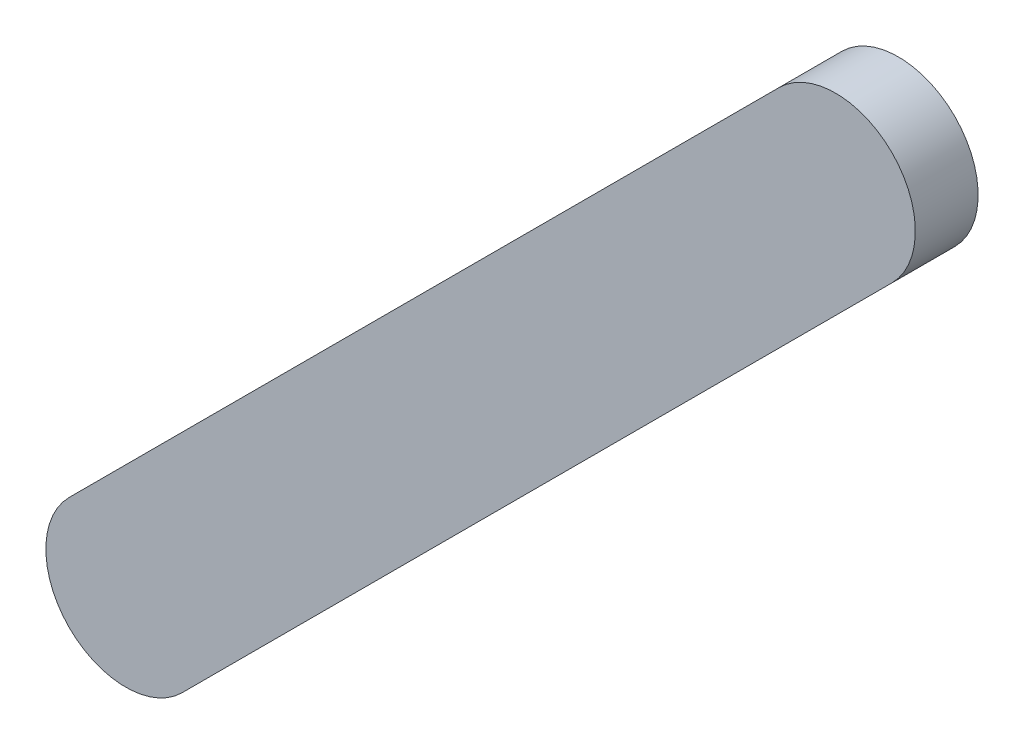
ISO-10303-21;
HEADER;
FILE_DESCRIPTION(('STEP AP214'),'2;1');
FILE_NAME('part.step','',(''),(''),'','','');
FILE_SCHEMA(('AUTOMOTIVE_DESIGN { 1 0 10303 214 1 1 1 1 }'));
ENDSEC;
DATA;
#1=APPLICATION_CONTEXT('core data for automotive mechanical design processes');
#2=APPLICATION_PROTOCOL_DEFINITION('international standard','automotive_design',2000,#1);
#3=PRODUCT_CONTEXT('',#1,'mechanical');
#4=PRODUCT('Part','Part','',(#3));
#5=PRODUCT_RELATED_PRODUCT_CATEGORY('part','',(#4));
#6=PRODUCT_DEFINITION_FORMATION('','',#4);
#7=PRODUCT_DEFINITION_CONTEXT('part definition',#1,'design');
#8=PRODUCT_DEFINITION('design','',#6,#7);
#9=PRODUCT_DEFINITION_SHAPE('','',#8);
#10=(LENGTH_UNIT() NAMED_UNIT(*) SI_UNIT(.MILLI.,.METRE.));
#11=(NAMED_UNIT(*) PLANE_ANGLE_UNIT() SI_UNIT($,.RADIAN.));
#12=(NAMED_UNIT(*) SI_UNIT($,.STERADIAN.) SOLID_ANGLE_UNIT());
#13=UNCERTAINTY_MEASURE_WITH_UNIT(LENGTH_MEASURE(1.E-05),#10,'distance_accuracy_value','');
#14=(GEOMETRIC_REPRESENTATION_CONTEXT(3) GLOBAL_UNCERTAINTY_ASSIGNED_CONTEXT((#13)) GLOBAL_UNIT_ASSIGNED_CONTEXT((#10,
#11,#12)) REPRESENTATION_CONTEXT('',''));
#15=CARTESIAN_POINT('',(0.,0.,0.));
#16=DIRECTION('',(0.,0.,1.));
#17=DIRECTION('',(1.,0.,0.));
#18=AXIS2_PLACEMENT_3D('',#15,#16,#17);
#19=CARTESIAN_POINT('',(147.75360594,111.17399406,0.));
#20=DIRECTION('',(-0.70710678118655,0.707106781186545,0.));
#21=DIRECTION('',(0.707106781186545,0.70710678118655,0.));
#22=AXIS2_PLACEMENT_3D('',#19,#20,#21);
#23=PLANE('',#22);
#24=DIRECTION('',(0.707106781186545,0.70710678118655,0.));
#25=VECTOR('',#24,1.);
#26=CARTESIAN_POINT('',(147.75360594,111.17399406,0.1999996));
#27=LINE('',#26,#25);
#28=CARTESIAN_POINT('',(147.75360594,111.17399406,0.1999996));
#29=VERTEX_POINT('',#28);
#30=CARTESIAN_POINT('',(150.01420594,113.43459406,0.1999996));
#31=VERTEX_POINT('',#30);
#32=EDGE_CURVE('E11',#29,#31,#27,.T.);
#33=ORIENTED_EDGE('',*,*,#32,.F.);
#34=DIRECTION('',(0.,0.,1.));
#35=VECTOR('',#34,1.);
#36=CARTESIAN_POINT('',(147.75360594,111.17399406,0.));
#37=LINE('',#36,#35);
#38=CARTESIAN_POINT('',(147.75360594,111.17399406,0.));
#39=VERTEX_POINT('',#38);
#40=EDGE_CURVE('E24',#39,#29,#37,.T.);
#41=ORIENTED_EDGE('',*,*,#40,.F.);
#42=DIRECTION('',(0.707106781186545,0.70710678118655,0.));
#43=VECTOR('',#42,1.);
#44=CARTESIAN_POINT('',(147.75360594,111.17399406,0.));
#45=LINE('',#44,#43);
#46=CARTESIAN_POINT('',(150.01420594,113.43459406,0.));
#47=VERTEX_POINT('',#46);
#48=EDGE_CURVE('E75',#39,#47,#45,.T.);
#49=ORIENTED_EDGE('',*,*,#48,.T.);
#50=DIRECTION('',(0.,0.,1.));
#51=VECTOR('',#50,1.);
#52=CARTESIAN_POINT('',(150.01420594,113.43459406,0.));
#53=LINE('',#52,#51);
#54=EDGE_CURVE('E37',#47,#31,#53,.T.);
#55=ORIENTED_EDGE('',*,*,#54,.T.);
#56=EDGE_LOOP('',(#33,#41,#49,#55));
#57=FACE_BOUND('',#56,.T.);
#58=ADVANCED_FACE('F17',(#57),#23,.F.);
#59=CARTESIAN_POINT('',(149.8346,113.6142,0.));
#60=DIRECTION('',(0.,0.,-1.));
#61=DIRECTION('',(0.707106781186576,-0.70710678118652,0.));
#62=AXIS2_PLACEMENT_3D('',#59,#60,#61);
#63=CYLINDRICAL_SURFACE('',#62,0.254001156230774);
#64=CARTESIAN_POINT('',(149.8346,113.6142,0.1999996));
#65=DIRECTION('',(0.,0.,1.));
#66=DIRECTION('',(0.707106781186576,-0.70710678118652,0.));
#67=AXIS2_PLACEMENT_3D('',#64,#65,#66);
#68=CIRCLE('',#67,0.254001156230774);
#69=CARTESIAN_POINT('',(149.65499406,113.79380594,0.1999996));
#70=VERTEX_POINT('',#69);
#71=EDGE_CURVE('E83',#31,#70,#68,.T.);
#72=ORIENTED_EDGE('',*,*,#71,.F.);
#73=ORIENTED_EDGE('',*,*,#54,.F.);
#74=CARTESIAN_POINT('',(149.8346,113.6142,0.));
#75=DIRECTION('',(0.,0.,1.));
#76=DIRECTION('',(0.707106781186576,-0.70710678118652,0.));
#77=AXIS2_PLACEMENT_3D('',#74,#75,#76);
#78=CIRCLE('',#77,0.254001156230774);
#79=CARTESIAN_POINT('',(149.65499406,113.79380594,0.));
#80=VERTEX_POINT('',#79);
#81=EDGE_CURVE('E81',#47,#80,#78,.T.);
#82=ORIENTED_EDGE('',*,*,#81,.T.);
#83=DIRECTION('',(0.,0.,1.));
#84=VECTOR('',#83,1.);
#85=CARTESIAN_POINT('',(149.65499406,113.79380594,0.));
#86=LINE('',#85,#84);
#87=EDGE_CURVE('E67',#80,#70,#86,.T.);
#88=ORIENTED_EDGE('',*,*,#87,.T.);
#89=EDGE_LOOP('',(#72,#73,#82,#88));
#90=FACE_BOUND('',#89,.T.);
#91=ADVANCED_FACE('F89',(#90),#63,.T.);
#92=CARTESIAN_POINT('',(149.65499406,113.79380594,0.));
#93=DIRECTION('',(0.70710678118655,-0.707106781186545,0.));
#94=DIRECTION('',(-0.707106781186545,-0.70710678118655,0.));
#95=AXIS2_PLACEMENT_3D('',#92,#93,#94);
#96=PLANE('',#95);
#97=DIRECTION('',(-0.707106781186545,-0.70710678118655,0.));
#98=VECTOR('',#97,1.);
#99=CARTESIAN_POINT('',(149.65499406,113.79380594,0.1999996));
#100=LINE('',#99,#98);
#101=CARTESIAN_POINT('',(147.39439406,111.53320594,0.1999996));
#102=VERTEX_POINT('',#101);
#103=EDGE_CURVE('E71',#70,#102,#100,.T.);
#104=ORIENTED_EDGE('',*,*,#103,.F.);
#105=ORIENTED_EDGE('',*,*,#87,.F.);
#106=DIRECTION('',(-0.707106781186545,-0.70710678118655,0.));
#107=VECTOR('',#106,1.);
#108=CARTESIAN_POINT('',(149.65499406,113.79380594,0.));
#109=LINE('',#108,#107);
#110=CARTESIAN_POINT('',(147.39439406,111.53320594,0.));
#111=VERTEX_POINT('',#110);
#112=EDGE_CURVE('E63',#80,#111,#109,.T.);
#113=ORIENTED_EDGE('',*,*,#112,.T.);
#114=DIRECTION('',(0.,0.,1.));
#115=VECTOR('',#114,1.);
#116=CARTESIAN_POINT('',(147.39439406,111.53320594,0.));
#117=LINE('',#116,#115);
#118=EDGE_CURVE('E53',#111,#102,#117,.T.);
#119=ORIENTED_EDGE('',*,*,#118,.T.);
#120=EDGE_LOOP('',(#104,#105,#113,#119));
#121=FACE_BOUND('',#120,.T.);
#122=ADVANCED_FACE('F66',(#121),#96,.F.);
#123=CARTESIAN_POINT('',(147.574,111.3536,0.));
#124=DIRECTION('',(0.,0.,-1.));
#125=DIRECTION('',(-0.707106781186576,0.70710678118652,0.));
#126=AXIS2_PLACEMENT_3D('',#123,#124,#125);
#127=CYLINDRICAL_SURFACE('',#126,0.254001156230774);
#128=CARTESIAN_POINT('',(147.574,111.3536,0.1999996));
#129=DIRECTION('',(0.,0.,1.));
#130=DIRECTION('',(-0.707106781186576,0.70710678118652,0.));
#131=AXIS2_PLACEMENT_3D('',#128,#129,#130);
#132=CIRCLE('',#131,0.254001156230774);
#133=EDGE_CURVE('E59',#102,#29,#132,.T.);
#134=ORIENTED_EDGE('',*,*,#133,.F.);
#135=ORIENTED_EDGE('',*,*,#118,.F.);
#136=CARTESIAN_POINT('',(147.574,111.3536,0.));
#137=DIRECTION('',(0.,0.,1.));
#138=DIRECTION('',(-0.707106781186576,0.70710678118652,0.));
#139=AXIS2_PLACEMENT_3D('',#136,#137,#138);
#140=CIRCLE('',#139,0.254001156230774);
#141=EDGE_CURVE('E57',#111,#39,#140,.T.);
#142=ORIENTED_EDGE('',*,*,#141,.T.);
#143=ORIENTED_EDGE('',*,*,#40,.T.);
#144=EDGE_LOOP('',(#134,#135,#142,#143));
#145=FACE_BOUND('',#144,.T.);
#146=ADVANCED_FACE('F55',(#145),#127,.T.);
#147=CARTESIAN_POINT('',(147.75360594,111.17399406,0.));
#148=DIRECTION('',(0.,0.,-1.));
#149=DIRECTION('',(-1.,0.,0.));
#150=AXIS2_PLACEMENT_3D('',#147,#148,#149);
#151=PLANE('',#150);
#152=ORIENTED_EDGE('',*,*,#141,.F.);
#153=ORIENTED_EDGE('',*,*,#112,.F.);
#154=ORIENTED_EDGE('',*,*,#81,.F.);
#155=ORIENTED_EDGE('',*,*,#48,.F.);
#156=EDGE_LOOP('',(#152,#153,#154,#155));
#157=FACE_BOUND('',#156,.T.);
#158=ADVANCED_FACE('F74',(#157),#151,.T.);
#159=CARTESIAN_POINT('',(147.75360594,111.17399406,0.1999996));
#160=DIRECTION('',(0.,0.,-1.));
#161=DIRECTION('',(-1.,0.,0.));
#162=AXIS2_PLACEMENT_3D('',#159,#160,#161);
#163=PLANE('',#162);
#164=ORIENTED_EDGE('',*,*,#32,.T.);
#165=ORIENTED_EDGE('',*,*,#71,.T.);
#166=ORIENTED_EDGE('',*,*,#103,.T.);
#167=ORIENTED_EDGE('',*,*,#133,.T.);
#168=EDGE_LOOP('',(#164,#165,#166,#167));
#169=FACE_BOUND('',#168,.T.);
#170=ADVANCED_FACE('F91',(#169),#163,.F.);
#171=CLOSED_SHELL('',(#58,#91,#122,#146,#158,#170));
#172=MANIFOLD_SOLID_BREP('B1',#171);
#173=ADVANCED_BREP_SHAPE_REPRESENTATION('',(#18,#172),#14);
#174=SHAPE_DEFINITION_REPRESENTATION(#9,#173);
ENDSEC;
END-ISO-10303-21;
